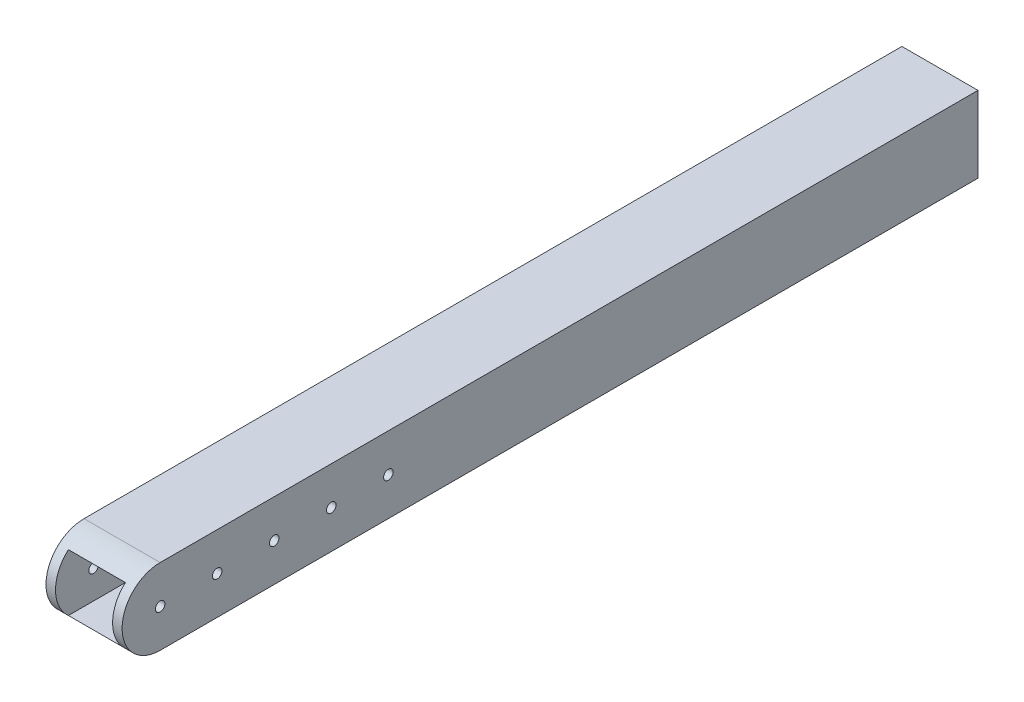
ISO-10303-21;
HEADER;
FILE_DESCRIPTION(('STEP AP214'),'2;1');
FILE_NAME('part.step','',(''),(''),'','','');
FILE_SCHEMA(('AUTOMOTIVE_DESIGN { 1 0 10303 214 1 1 1 1 }'));
ENDSEC;
DATA;
#1=APPLICATION_CONTEXT('core data for automotive mechanical design processes');
#2=APPLICATION_PROTOCOL_DEFINITION('international standard','automotive_design',2000,#1);
#3=PRODUCT_CONTEXT('',#1,'mechanical');
#4=PRODUCT('Part','Part','',(#3));
#5=PRODUCT_RELATED_PRODUCT_CATEGORY('part','',(#4));
#6=PRODUCT_DEFINITION_FORMATION('','',#4);
#7=PRODUCT_DEFINITION_CONTEXT('part definition',#1,'design');
#8=PRODUCT_DEFINITION('design','',#6,#7);
#9=PRODUCT_DEFINITION_SHAPE('','',#8);
#10=(LENGTH_UNIT() NAMED_UNIT(*) SI_UNIT(.MILLI.,.METRE.));
#11=(NAMED_UNIT(*) PLANE_ANGLE_UNIT() SI_UNIT($,.RADIAN.));
#12=(NAMED_UNIT(*) SI_UNIT($,.STERADIAN.) SOLID_ANGLE_UNIT());
#13=UNCERTAINTY_MEASURE_WITH_UNIT(LENGTH_MEASURE(1.E-05),#10,'distance_accuracy_value','');
#14=(GEOMETRIC_REPRESENTATION_CONTEXT(3) GLOBAL_UNCERTAINTY_ASSIGNED_CONTEXT((#13)) GLOBAL_UNIT_ASSIGNED_CONTEXT((#10,
#11,#12)) REPRESENTATION_CONTEXT('',''));
#15=CARTESIAN_POINT('',(0.,0.,0.));
#16=DIRECTION('',(0.,0.,1.));
#17=DIRECTION('',(1.,0.,0.));
#18=AXIS2_PLACEMENT_3D('',#15,#16,#17);
#19=CARTESIAN_POINT('',(20.,-20.,450.));
#20=DIRECTION('',(-1.,0.,0.));
#21=DIRECTION('',(0.,0.,1.));
#22=AXIS2_PLACEMENT_3D('',#19,#20,#21);
#23=PLANE('',#22);
#24=CARTESIAN_POINT('',(20.,0.,310.));
#25=DIRECTION('',(1.,0.,0.));
#26=DIRECTION('',(0.,0.,-1.));
#27=AXIS2_PLACEMENT_3D('',#24,#25,#26);
#28=CIRCLE('',#27,2.50000000000002);
#29=CARTESIAN_POINT('',(20.,0.,307.5));
#30=VERTEX_POINT('',#29);
#31=EDGE_CURVE('E269',#30,#30,#28,.T.);
#32=ORIENTED_EDGE('',*,*,#31,.F.);
#33=EDGE_LOOP('',(#32));
#34=FACE_BOUND('',#33,.T.);
#35=CARTESIAN_POINT('',(20.,0.,340.));
#36=DIRECTION('',(1.,0.,0.));
#37=DIRECTION('',(0.,0.,-1.));
#38=AXIS2_PLACEMENT_3D('',#35,#36,#37);
#39=CIRCLE('',#38,2.50000000000002);
#40=CARTESIAN_POINT('',(20.,0.,337.5));
#41=VERTEX_POINT('',#40);
#42=EDGE_CURVE('E263',#41,#41,#39,.T.);
#43=ORIENTED_EDGE('',*,*,#42,.F.);
#44=EDGE_LOOP('',(#43));
#45=FACE_BOUND('',#44,.T.);
#46=CARTESIAN_POINT('',(20.,0.,370.));
#47=DIRECTION('',(1.,0.,0.));
#48=DIRECTION('',(0.,0.,-1.));
#49=AXIS2_PLACEMENT_3D('',#46,#47,#48);
#50=CIRCLE('',#49,2.50000000000002);
#51=CARTESIAN_POINT('',(20.,0.,367.5));
#52=VERTEX_POINT('',#51);
#53=EDGE_CURVE('E257',#52,#52,#50,.T.);
#54=ORIENTED_EDGE('',*,*,#53,.F.);
#55=EDGE_LOOP('',(#54));
#56=FACE_BOUND('',#55,.T.);
#57=CARTESIAN_POINT('',(20.,0.,400.));
#58=DIRECTION('',(1.,0.,0.));
#59=DIRECTION('',(0.,0.,-1.));
#60=AXIS2_PLACEMENT_3D('',#57,#58,#59);
#61=CIRCLE('',#60,2.50000000000002);
#62=CARTESIAN_POINT('',(20.,0.,397.5));
#63=VERTEX_POINT('',#62);
#64=EDGE_CURVE('E251',#63,#63,#61,.T.);
#65=ORIENTED_EDGE('',*,*,#64,.F.);
#66=EDGE_LOOP('',(#65));
#67=FACE_BOUND('',#66,.T.);
#68=CARTESIAN_POINT('',(20.,0.,430.));
#69=DIRECTION('',(1.,0.,0.));
#70=DIRECTION('',(0.,0.,-1.));
#71=AXIS2_PLACEMENT_3D('',#68,#69,#70);
#72=CIRCLE('',#71,2.50000000000002);
#73=CARTESIAN_POINT('',(20.,0.,427.5));
#74=VERTEX_POINT('',#73);
#75=EDGE_CURVE('E156',#74,#74,#72,.T.);
#76=ORIENTED_EDGE('',*,*,#75,.F.);
#77=EDGE_LOOP('',(#76));
#78=FACE_BOUND('',#77,.T.);
#79=DIRECTION('',(0.,0.,-1.));
#80=VECTOR('',#79,1.);
#81=CARTESIAN_POINT('',(20.,20.,450.));
#82=LINE('',#81,#80);
#83=CARTESIAN_POINT('',(20.,20.,430.));
#84=VERTEX_POINT('',#83);
#85=CARTESIAN_POINT('',(20.,20.,0.));
#86=VERTEX_POINT('',#85);
#87=EDGE_CURVE('E141',#84,#86,#82,.T.);
#88=ORIENTED_EDGE('',*,*,#87,.F.);
#89=CARTESIAN_POINT('',(20.,0.,430.));
#90=DIRECTION('',(1.,0.,0.));
#91=DIRECTION('',(0.,0.,-1.));
#92=AXIS2_PLACEMENT_3D('',#89,#90,#91);
#93=CIRCLE('',#92,20.);
#94=CARTESIAN_POINT('',(20.,-20.,430.));
#95=VERTEX_POINT('',#94);
#96=EDGE_CURVE('E128',#84,#95,#93,.T.);
#97=ORIENTED_EDGE('',*,*,#96,.T.);
#98=DIRECTION('',(0.,0.,-1.));
#99=VECTOR('',#98,1.);
#100=CARTESIAN_POINT('',(20.,-20.,450.));
#101=LINE('',#100,#99);
#102=CARTESIAN_POINT('',(20.,-20.,0.));
#103=VERTEX_POINT('',#102);
#104=EDGE_CURVE('E83',#95,#103,#101,.T.);
#105=ORIENTED_EDGE('',*,*,#104,.T.);
#106=DIRECTION('',(0.,1.,0.));
#107=VECTOR('',#106,1.);
#108=CARTESIAN_POINT('',(20.,-20.,0.));
#109=LINE('',#108,#107);
#110=EDGE_CURVE('E147',#103,#86,#109,.T.);
#111=ORIENTED_EDGE('',*,*,#110,.T.);
#112=EDGE_LOOP('',(#88,#97,#105,#111));
#113=FACE_BOUND('',#112,.T.);
#114=ADVANCED_FACE('F62',(#34,#45,#56,#67,#78,#113),#23,.F.);
#115=CARTESIAN_POINT('',(-20.,-20.,450.));
#116=DIRECTION('',(1.,0.,0.));
#117=DIRECTION('',(0.,0.,-1.));
#118=AXIS2_PLACEMENT_3D('',#115,#116,#117);
#119=PLANE('',#118);
#120=CARTESIAN_POINT('',(-20.,0.,310.));
#121=DIRECTION('',(1.,0.,0.));
#122=DIRECTION('',(0.,0.,-1.));
#123=AXIS2_PLACEMENT_3D('',#120,#121,#122);
#124=CIRCLE('',#123,2.50000000000002);
#125=CARTESIAN_POINT('',(-20.,0.,307.5));
#126=VERTEX_POINT('',#125);
#127=EDGE_CURVE('E245',#126,#126,#124,.T.);
#128=ORIENTED_EDGE('',*,*,#127,.T.);
#129=EDGE_LOOP('',(#128));
#130=FACE_BOUND('',#129,.T.);
#131=CARTESIAN_POINT('',(-20.,0.,340.));
#132=DIRECTION('',(1.,0.,0.));
#133=DIRECTION('',(0.,0.,-1.));
#134=AXIS2_PLACEMENT_3D('',#131,#132,#133);
#135=CIRCLE('',#134,2.50000000000002);
#136=CARTESIAN_POINT('',(-20.,0.,337.5));
#137=VERTEX_POINT('',#136);
#138=EDGE_CURVE('E239',#137,#137,#135,.T.);
#139=ORIENTED_EDGE('',*,*,#138,.T.);
#140=EDGE_LOOP('',(#139));
#141=FACE_BOUND('',#140,.T.);
#142=CARTESIAN_POINT('',(-20.,0.,370.));
#143=DIRECTION('',(1.,0.,0.));
#144=DIRECTION('',(0.,0.,-1.));
#145=AXIS2_PLACEMENT_3D('',#142,#143,#144);
#146=CIRCLE('',#145,2.50000000000002);
#147=CARTESIAN_POINT('',(-20.,0.,367.5));
#148=VERTEX_POINT('',#147);
#149=EDGE_CURVE('E233',#148,#148,#146,.T.);
#150=ORIENTED_EDGE('',*,*,#149,.T.);
#151=EDGE_LOOP('',(#150));
#152=FACE_BOUND('',#151,.T.);
#153=CARTESIAN_POINT('',(-20.,0.,400.));
#154=DIRECTION('',(1.,0.,0.));
#155=DIRECTION('',(0.,0.,-1.));
#156=AXIS2_PLACEMENT_3D('',#153,#154,#155);
#157=CIRCLE('',#156,2.50000000000002);
#158=CARTESIAN_POINT('',(-20.,0.,397.5));
#159=VERTEX_POINT('',#158);
#160=EDGE_CURVE('E144',#159,#159,#157,.T.);
#161=ORIENTED_EDGE('',*,*,#160,.T.);
#162=EDGE_LOOP('',(#161));
#163=FACE_BOUND('',#162,.T.);
#164=CARTESIAN_POINT('',(-20.,0.,430.));
#165=DIRECTION('',(1.,0.,0.));
#166=DIRECTION('',(0.,0.,-1.));
#167=AXIS2_PLACEMENT_3D('',#164,#165,#166);
#168=CIRCLE('',#167,2.50000000000002);
#169=CARTESIAN_POINT('',(-20.,0.,427.5));
#170=VERTEX_POINT('',#169);
#171=EDGE_CURVE('E160',#170,#170,#168,.T.);
#172=ORIENTED_EDGE('',*,*,#171,.T.);
#173=EDGE_LOOP('',(#172));
#174=FACE_BOUND('',#173,.T.);
#175=CARTESIAN_POINT('',(-20.,0.,430.));
#176=DIRECTION('',(1.,0.,0.));
#177=DIRECTION('',(0.,0.,-1.));
#178=AXIS2_PLACEMENT_3D('',#175,#176,#177);
#179=CIRCLE('',#178,20.);
#180=CARTESIAN_POINT('',(-20.,20.,430.));
#181=VERTEX_POINT('',#180);
#182=CARTESIAN_POINT('',(-20.,-20.,430.));
#183=VERTEX_POINT('',#182);
#184=EDGE_CURVE('E163',#181,#183,#179,.T.);
#185=ORIENTED_EDGE('',*,*,#184,.F.);
#186=DIRECTION('',(0.,0.,-1.));
#187=VECTOR('',#186,1.);
#188=CARTESIAN_POINT('',(-20.,20.,450.));
#189=LINE('',#188,#187);
#190=CARTESIAN_POINT('',(-20.,20.,0.));
#191=VERTEX_POINT('',#190);
#192=EDGE_CURVE('E143',#181,#191,#189,.T.);
#193=ORIENTED_EDGE('',*,*,#192,.T.);
#194=DIRECTION('',(0.,-1.,0.));
#195=VECTOR('',#194,1.);
#196=CARTESIAN_POINT('',(-20.,-20.,0.));
#197=LINE('',#196,#195);
#198=CARTESIAN_POINT('',(-20.,-20.,0.));
#199=VERTEX_POINT('',#198);
#200=EDGE_CURVE('E195',#191,#199,#197,.T.);
#201=ORIENTED_EDGE('',*,*,#200,.T.);
#202=DIRECTION('',(0.,0.,-1.));
#203=VECTOR('',#202,1.);
#204=CARTESIAN_POINT('',(-20.,-20.,450.));
#205=LINE('',#204,#203);
#206=EDGE_CURVE('E149',#183,#199,#205,.T.);
#207=ORIENTED_EDGE('',*,*,#206,.F.);
#208=EDGE_LOOP('',(#185,#193,#201,#207));
#209=FACE_BOUND('',#208,.T.);
#210=ADVANCED_FACE('F206',(#130,#141,#152,#163,#174,#209),#119,.F.);
#211=CARTESIAN_POINT('',(-15.,-15.,450.));
#212=DIRECTION('',(1.,0.,0.));
#213=DIRECTION('',(0.,0.,-1.));
#214=AXIS2_PLACEMENT_3D('',#211,#212,#213);
#215=PLANE('',#214);
#216=CARTESIAN_POINT('',(-15.,0.,310.));
#217=DIRECTION('',(1.,0.,0.));
#218=DIRECTION('',(0.,0.,-1.));
#219=AXIS2_PLACEMENT_3D('',#216,#217,#218);
#220=CIRCLE('',#219,2.50000000000002);
#221=CARTESIAN_POINT('',(-15.,0.,307.5));
#222=VERTEX_POINT('',#221);
#223=EDGE_CURVE('E248',#222,#222,#220,.T.);
#224=ORIENTED_EDGE('',*,*,#223,.F.);
#225=EDGE_LOOP('',(#224));
#226=FACE_BOUND('',#225,.T.);
#227=CARTESIAN_POINT('',(-15.,0.,340.));
#228=DIRECTION('',(1.,0.,0.));
#229=DIRECTION('',(0.,0.,-1.));
#230=AXIS2_PLACEMENT_3D('',#227,#228,#229);
#231=CIRCLE('',#230,2.50000000000002);
#232=CARTESIAN_POINT('',(-15.,0.,337.5));
#233=VERTEX_POINT('',#232);
#234=EDGE_CURVE('E242',#233,#233,#231,.T.);
#235=ORIENTED_EDGE('',*,*,#234,.F.);
#236=EDGE_LOOP('',(#235));
#237=FACE_BOUND('',#236,.T.);
#238=CARTESIAN_POINT('',(-15.,0.,370.));
#239=DIRECTION('',(1.,0.,0.));
#240=DIRECTION('',(0.,0.,-1.));
#241=AXIS2_PLACEMENT_3D('',#238,#239,#240);
#242=CIRCLE('',#241,2.50000000000002);
#243=CARTESIAN_POINT('',(-15.,0.,367.5));
#244=VERTEX_POINT('',#243);
#245=EDGE_CURVE('E236',#244,#244,#242,.T.);
#246=ORIENTED_EDGE('',*,*,#245,.F.);
#247=EDGE_LOOP('',(#246));
#248=FACE_BOUND('',#247,.T.);
#249=CARTESIAN_POINT('',(-15.,0.,400.));
#250=DIRECTION('',(1.,0.,0.));
#251=DIRECTION('',(0.,0.,-1.));
#252=AXIS2_PLACEMENT_3D('',#249,#250,#251);
#253=CIRCLE('',#252,2.50000000000002);
#254=CARTESIAN_POINT('',(-15.,0.,397.5));
#255=VERTEX_POINT('',#254);
#256=EDGE_CURVE('E230',#255,#255,#253,.T.);
#257=ORIENTED_EDGE('',*,*,#256,.F.);
#258=EDGE_LOOP('',(#257));
#259=FACE_BOUND('',#258,.T.);
#260=CARTESIAN_POINT('',(-15.,0.,430.));
#261=DIRECTION('',(1.,0.,0.));
#262=DIRECTION('',(0.,0.,-1.));
#263=AXIS2_PLACEMENT_3D('',#260,#261,#262);
#264=CIRCLE('',#263,2.50000000000002);
#265=CARTESIAN_POINT('',(-15.,0.,427.5));
#266=VERTEX_POINT('',#265);
#267=EDGE_CURVE('E155',#266,#266,#264,.T.);
#268=ORIENTED_EDGE('',*,*,#267,.F.);
#269=EDGE_LOOP('',(#268));
#270=FACE_BOUND('',#269,.T.);
#271=DIRECTION('',(0.,0.,-1.));
#272=VECTOR('',#271,1.);
#273=CARTESIAN_POINT('',(-15.,15.,450.));
#274=LINE('',#273,#272);
#275=CARTESIAN_POINT('',(-15.,15.,443.228756555323));
#276=VERTEX_POINT('',#275);
#277=CARTESIAN_POINT('',(-15.,15.,0.));
#278=VERTEX_POINT('',#277);
#279=EDGE_CURVE('E75',#276,#278,#274,.T.);
#280=ORIENTED_EDGE('',*,*,#279,.F.);
#281=CARTESIAN_POINT('',(-15.,0.,430.));
#282=DIRECTION('',(1.,0.,0.));
#283=DIRECTION('',(0.,0.,-1.));
#284=AXIS2_PLACEMENT_3D('',#281,#282,#283);
#285=CIRCLE('',#284,20.);
#286=CARTESIAN_POINT('',(-15.,-15.,443.228756555323));
#287=VERTEX_POINT('',#286);
#288=EDGE_CURVE('E167',#276,#287,#285,.T.);
#289=ORIENTED_EDGE('',*,*,#288,.T.);
#290=DIRECTION('',(0.,0.,-1.));
#291=VECTOR('',#290,1.);
#292=CARTESIAN_POINT('',(-15.,-15.,450.));
#293=LINE('',#292,#291);
#294=CARTESIAN_POINT('',(-15.,-15.,0.));
#295=VERTEX_POINT('',#294);
#296=EDGE_CURVE('E190',#287,#295,#293,.T.);
#297=ORIENTED_EDGE('',*,*,#296,.T.);
#298=DIRECTION('',(0.,-1.,0.));
#299=VECTOR('',#298,1.);
#300=CARTESIAN_POINT('',(-15.,-15.,0.));
#301=LINE('',#300,#299);
#302=EDGE_CURVE('E173',#278,#295,#301,.T.);
#303=ORIENTED_EDGE('',*,*,#302,.F.);
#304=EDGE_LOOP('',(#280,#289,#297,#303));
#305=FACE_BOUND('',#304,.T.);
#306=ADVANCED_FACE('F281',(#226,#237,#248,#259,#270,#305),#215,.T.);
#307=CARTESIAN_POINT('',(15.,-15.,450.));
#308=DIRECTION('',(-1.,0.,0.));
#309=DIRECTION('',(0.,-1.,0.));
#310=AXIS2_PLACEMENT_3D('',#307,#308,#309);
#311=PLANE('',#310);
#312=CARTESIAN_POINT('',(15.,0.,310.));
#313=DIRECTION('',(-1.,0.,0.));
#314=DIRECTION('',(0.,-1.,0.));
#315=AXIS2_PLACEMENT_3D('',#312,#313,#314);
#316=CIRCLE('',#315,2.50000000000002);
#317=CARTESIAN_POINT('',(15.,-2.50000000000002,310.));
#318=VERTEX_POINT('',#317);
#319=EDGE_CURVE('E272',#318,#318,#316,.T.);
#320=ORIENTED_EDGE('',*,*,#319,.F.);
#321=EDGE_LOOP('',(#320));
#322=FACE_BOUND('',#321,.T.);
#323=CARTESIAN_POINT('',(15.,0.,340.));
#324=DIRECTION('',(-1.,0.,0.));
#325=DIRECTION('',(0.,-1.,0.));
#326=AXIS2_PLACEMENT_3D('',#323,#324,#325);
#327=CIRCLE('',#326,2.50000000000002);
#328=CARTESIAN_POINT('',(15.,-2.50000000000002,340.));
#329=VERTEX_POINT('',#328);
#330=EDGE_CURVE('E266',#329,#329,#327,.T.);
#331=ORIENTED_EDGE('',*,*,#330,.F.);
#332=EDGE_LOOP('',(#331));
#333=FACE_BOUND('',#332,.T.);
#334=CARTESIAN_POINT('',(15.,0.,370.));
#335=DIRECTION('',(-1.,0.,0.));
#336=DIRECTION('',(0.,-1.,0.));
#337=AXIS2_PLACEMENT_3D('',#334,#335,#336);
#338=CIRCLE('',#337,2.50000000000002);
#339=CARTESIAN_POINT('',(15.,-2.50000000000002,370.));
#340=VERTEX_POINT('',#339);
#341=EDGE_CURVE('E260',#340,#340,#338,.T.);
#342=ORIENTED_EDGE('',*,*,#341,.F.);
#343=EDGE_LOOP('',(#342));
#344=FACE_BOUND('',#343,.T.);
#345=CARTESIAN_POINT('',(15.,0.,400.));
#346=DIRECTION('',(-1.,0.,0.));
#347=DIRECTION('',(0.,-1.,0.));
#348=AXIS2_PLACEMENT_3D('',#345,#346,#347);
#349=CIRCLE('',#348,2.50000000000002);
#350=CARTESIAN_POINT('',(15.,-2.50000000000002,400.));
#351=VERTEX_POINT('',#350);
#352=EDGE_CURVE('E254',#351,#351,#349,.T.);
#353=ORIENTED_EDGE('',*,*,#352,.F.);
#354=EDGE_LOOP('',(#353));
#355=FACE_BOUND('',#354,.T.);
#356=CARTESIAN_POINT('',(15.,0.,430.));
#357=DIRECTION('',(-1.,0.,0.));
#358=DIRECTION('',(0.,-1.,0.));
#359=AXIS2_PLACEMENT_3D('',#356,#357,#358);
#360=CIRCLE('',#359,2.50000000000002);
#361=CARTESIAN_POINT('',(15.,-2.50000000000002,430.));
#362=VERTEX_POINT('',#361);
#363=EDGE_CURVE('E153',#362,#362,#360,.T.);
#364=ORIENTED_EDGE('',*,*,#363,.F.);
#365=EDGE_LOOP('',(#364));
#366=FACE_BOUND('',#365,.T.);
#367=CARTESIAN_POINT('',(15.,0.,430.));
#368=DIRECTION('',(-1.,0.,0.));
#369=DIRECTION('',(0.,-1.,0.));
#370=AXIS2_PLACEMENT_3D('',#367,#368,#369);
#371=CIRCLE('',#370,20.);
#372=CARTESIAN_POINT('',(15.,-15.,443.228756555323));
#373=VERTEX_POINT('',#372);
#374=CARTESIAN_POINT('',(15.,15.,443.228756555323));
#375=VERTEX_POINT('',#374);
#376=EDGE_CURVE('E69',#373,#375,#371,.T.);
#377=ORIENTED_EDGE('',*,*,#376,.T.);
#378=DIRECTION('',(0.,0.,-1.));
#379=VECTOR('',#378,1.);
#380=CARTESIAN_POINT('',(15.,15.,450.));
#381=LINE('',#380,#379);
#382=CARTESIAN_POINT('',(15.,15.,0.));
#383=VERTEX_POINT('',#382);
#384=EDGE_CURVE('E186',#375,#383,#381,.T.);
#385=ORIENTED_EDGE('',*,*,#384,.T.);
#386=DIRECTION('',(0.,1.,0.));
#387=VECTOR('',#386,1.);
#388=CARTESIAN_POINT('',(15.,-15.,0.));
#389=LINE('',#388,#387);
#390=CARTESIAN_POINT('',(15.,-15.,0.));
#391=VERTEX_POINT('',#390);
#392=EDGE_CURVE('E179',#391,#383,#389,.T.);
#393=ORIENTED_EDGE('',*,*,#392,.F.);
#394=DIRECTION('',(0.,0.,-1.));
#395=VECTOR('',#394,1.);
#396=CARTESIAN_POINT('',(15.,-15.,450.));
#397=LINE('',#396,#395);
#398=EDGE_CURVE('E188',#373,#391,#397,.T.);
#399=ORIENTED_EDGE('',*,*,#398,.F.);
#400=EDGE_LOOP('',(#377,#385,#393,#399));
#401=FACE_BOUND('',#400,.T.);
#402=ADVANCED_FACE('F218',(#322,#333,#344,#355,#366,#401),#311,.T.);
#403=CARTESIAN_POINT('',(-15.,15.,450.));
#404=DIRECTION('',(0.,-1.,0.));
#405=DIRECTION('',(1.,0.,0.));
#406=AXIS2_PLACEMENT_3D('',#403,#404,#405);
#407=PLANE('',#406);
#408=ORIENTED_EDGE('',*,*,#384,.F.);
#409=DIRECTION('',(1.,0.,0.));
#410=VECTOR('',#409,1.);
#411=CARTESIAN_POINT('',(-55.9999999999999,15.,443.228756555323));
#412=LINE('',#411,#410);
#413=EDGE_CURVE('E12',#375,#276,#412,.F.);
#414=ORIENTED_EDGE('',*,*,#413,.T.);
#415=ORIENTED_EDGE('',*,*,#279,.T.);
#416=DIRECTION('',(-1.,0.,0.));
#417=VECTOR('',#416,1.);
#418=CARTESIAN_POINT('',(-15.,15.,0.));
#419=LINE('',#418,#417);
#420=EDGE_CURVE('E182',#383,#278,#419,.T.);
#421=ORIENTED_EDGE('',*,*,#420,.F.);
#422=EDGE_LOOP('',(#408,#414,#415,#421));
#423=FACE_BOUND('',#422,.T.);
#424=ADVANCED_FACE('F215',(#423),#407,.T.);
#425=CARTESIAN_POINT('',(-20.,-20.,450.));
#426=DIRECTION('',(0.,1.,0.));
#427=DIRECTION('',(0.,0.,1.));
#428=AXIS2_PLACEMENT_3D('',#425,#426,#427);
#429=PLANE('',#428);
#430=DIRECTION('',(1.,0.,0.));
#431=VECTOR('',#430,1.);
#432=CARTESIAN_POINT('',(-55.9999999999999,-20.,430.));
#433=LINE('',#432,#431);
#434=EDGE_CURVE('E135',#183,#95,#433,.T.);
#435=ORIENTED_EDGE('',*,*,#434,.F.);
#436=ORIENTED_EDGE('',*,*,#206,.T.);
#437=DIRECTION('',(1.,0.,0.));
#438=VECTOR('',#437,1.);
#439=CARTESIAN_POINT('',(-20.,-20.,0.));
#440=LINE('',#439,#438);
#441=EDGE_CURVE('E198',#199,#103,#440,.T.);
#442=ORIENTED_EDGE('',*,*,#441,.T.);
#443=ORIENTED_EDGE('',*,*,#104,.F.);
#444=EDGE_LOOP('',(#435,#436,#442,#443));
#445=FACE_BOUND('',#444,.T.);
#446=ADVANCED_FACE('F202',(#445),#429,.F.);
#447=CARTESIAN_POINT('',(-15.,-15.,450.));
#448=DIRECTION('',(0.,1.,0.));
#449=DIRECTION('',(0.,0.,1.));
#450=AXIS2_PLACEMENT_3D('',#447,#448,#449);
#451=PLANE('',#450);
#452=ORIENTED_EDGE('',*,*,#296,.F.);
#453=DIRECTION('',(1.,0.,0.));
#454=VECTOR('',#453,1.);
#455=CARTESIAN_POINT('',(-55.9999999999999,-15.,443.228756555323));
#456=LINE('',#455,#454);
#457=EDGE_CURVE('E222',#287,#373,#456,.T.);
#458=ORIENTED_EDGE('',*,*,#457,.T.);
#459=ORIENTED_EDGE('',*,*,#398,.T.);
#460=DIRECTION('',(1.,0.,0.));
#461=VECTOR('',#460,1.);
#462=CARTESIAN_POINT('',(-15.,-15.,0.));
#463=LINE('',#462,#461);
#464=EDGE_CURVE('E176',#295,#391,#463,.T.);
#465=ORIENTED_EDGE('',*,*,#464,.F.);
#466=EDGE_LOOP('',(#452,#458,#459,#465));
#467=FACE_BOUND('',#466,.T.);
#468=ADVANCED_FACE('F211',(#467),#451,.T.);
#469=CARTESIAN_POINT('',(0.,0.,0.));
#470=DIRECTION('',(0.,0.,-1.));
#471=DIRECTION('',(-1.,0.,0.));
#472=AXIS2_PLACEMENT_3D('',#469,#470,#471);
#473=PLANE('',#472);
#474=ORIENTED_EDGE('',*,*,#110,.F.);
#475=ORIENTED_EDGE('',*,*,#441,.F.);
#476=ORIENTED_EDGE('',*,*,#200,.F.);
#477=DIRECTION('',(-1.,0.,0.));
#478=VECTOR('',#477,1.);
#479=CARTESIAN_POINT('',(-20.,20.,0.));
#480=LINE('',#479,#478);
#481=EDGE_CURVE('E193',#86,#191,#480,.T.);
#482=ORIENTED_EDGE('',*,*,#481,.F.);
#483=EDGE_LOOP('',(#474,#475,#476,#482));
#484=FACE_BOUND('',#483,.T.);
#485=ORIENTED_EDGE('',*,*,#420,.T.);
#486=ORIENTED_EDGE('',*,*,#302,.T.);
#487=ORIENTED_EDGE('',*,*,#464,.T.);
#488=ORIENTED_EDGE('',*,*,#392,.T.);
#489=EDGE_LOOP('',(#485,#486,#487,#488));
#490=FACE_BOUND('',#489,.T.);
#491=ADVANCED_FACE('F208',(#484,#490),#473,.T.);
#492=CARTESIAN_POINT('',(-20.,20.,450.));
#493=DIRECTION('',(0.,-1.,0.));
#494=DIRECTION('',(0.,0.,-1.));
#495=AXIS2_PLACEMENT_3D('',#492,#493,#494);
#496=PLANE('',#495);
#497=ORIENTED_EDGE('',*,*,#192,.F.);
#498=DIRECTION('',(1.,0.,0.));
#499=VECTOR('',#498,1.);
#500=CARTESIAN_POINT('',(-55.9999999999999,20.,430.));
#501=LINE('',#500,#499);
#502=EDGE_CURVE('E132',#181,#84,#501,.T.);
#503=ORIENTED_EDGE('',*,*,#502,.T.);
#504=ORIENTED_EDGE('',*,*,#87,.T.);
#505=ORIENTED_EDGE('',*,*,#481,.T.);
#506=EDGE_LOOP('',(#497,#503,#504,#505));
#507=FACE_BOUND('',#506,.T.);
#508=ADVANCED_FACE('F139',(#507),#496,.F.);
#509=CARTESIAN_POINT('',(-430.,0.,430.));
#510=DIRECTION('',(1.,0.,0.));
#511=DIRECTION('',(0.,0.,-1.));
#512=AXIS2_PLACEMENT_3D('',#509,#510,#511);
#513=CYLINDRICAL_SURFACE('',#512,2.50000000000002);
#514=ORIENTED_EDGE('',*,*,#363,.T.);
#515=EDGE_LOOP('',(#514));
#516=FACE_BOUND('',#515,.T.);
#517=ORIENTED_EDGE('',*,*,#75,.T.);
#518=EDGE_LOOP('',(#517));
#519=FACE_BOUND('',#518,.T.);
#520=ADVANCED_FACE('F341',(#516,#519),#513,.F.);
#521=ORIENTED_EDGE('',*,*,#267,.T.);
#522=EDGE_LOOP('',(#521));
#523=FACE_BOUND('',#522,.T.);
#524=ORIENTED_EDGE('',*,*,#171,.F.);
#525=EDGE_LOOP('',(#524));
#526=FACE_BOUND('',#525,.T.);
#527=ADVANCED_FACE('F340',(#523,#526),#513,.F.);
#528=CARTESIAN_POINT('',(-55.9999999999999,0.,430.));
#529=DIRECTION('',(1.,0.,0.));
#530=DIRECTION('',(0.,0.,-1.));
#531=AXIS2_PLACEMENT_3D('',#528,#529,#530);
#532=CYLINDRICAL_SURFACE('',#531,20.);
#533=ORIENTED_EDGE('',*,*,#96,.F.);
#534=ORIENTED_EDGE('',*,*,#502,.F.);
#535=ORIENTED_EDGE('',*,*,#184,.T.);
#536=ORIENTED_EDGE('',*,*,#434,.T.);
#537=EDGE_LOOP('',(#533,#534,#535,#536));
#538=FACE_BOUND('',#537,.T.);
#539=ORIENTED_EDGE('',*,*,#413,.F.);
#540=ORIENTED_EDGE('',*,*,#376,.F.);
#541=ORIENTED_EDGE('',*,*,#457,.F.);
#542=ORIENTED_EDGE('',*,*,#288,.F.);
#543=EDGE_LOOP('',(#539,#540,#541,#542));
#544=FACE_BOUND('',#543,.T.);
#545=ADVANCED_FACE('F130',(#538,#544),#532,.T.);
#546=CARTESIAN_POINT('',(-430.,0.,400.));
#547=DIRECTION('',(1.,0.,0.));
#548=DIRECTION('',(0.,0.,-1.));
#549=AXIS2_PLACEMENT_3D('',#546,#547,#548);
#550=CYLINDRICAL_SURFACE('',#549,2.50000000000002);
#551=ORIENTED_EDGE('',*,*,#256,.T.);
#552=EDGE_LOOP('',(#551));
#553=FACE_BOUND('',#552,.T.);
#554=ORIENTED_EDGE('',*,*,#160,.F.);
#555=EDGE_LOOP('',(#554));
#556=FACE_BOUND('',#555,.T.);
#557=ADVANCED_FACE('F333',(#553,#556),#550,.F.);
#558=CARTESIAN_POINT('',(-430.,0.,370.));
#559=DIRECTION('',(1.,0.,0.));
#560=DIRECTION('',(0.,0.,-1.));
#561=AXIS2_PLACEMENT_3D('',#558,#559,#560);
#562=CYLINDRICAL_SURFACE('',#561,2.50000000000002);
#563=ORIENTED_EDGE('',*,*,#245,.T.);
#564=EDGE_LOOP('',(#563));
#565=FACE_BOUND('',#564,.T.);
#566=ORIENTED_EDGE('',*,*,#149,.F.);
#567=EDGE_LOOP('',(#566));
#568=FACE_BOUND('',#567,.T.);
#569=ADVANCED_FACE('F329',(#565,#568),#562,.F.);
#570=CARTESIAN_POINT('',(-430.,0.,340.));
#571=DIRECTION('',(1.,0.,0.));
#572=DIRECTION('',(0.,0.,-1.));
#573=AXIS2_PLACEMENT_3D('',#570,#571,#572);
#574=CYLINDRICAL_SURFACE('',#573,2.50000000000002);
#575=ORIENTED_EDGE('',*,*,#234,.T.);
#576=EDGE_LOOP('',(#575));
#577=FACE_BOUND('',#576,.T.);
#578=ORIENTED_EDGE('',*,*,#138,.F.);
#579=EDGE_LOOP('',(#578));
#580=FACE_BOUND('',#579,.T.);
#581=ADVANCED_FACE('F325',(#577,#580),#574,.F.);
#582=CARTESIAN_POINT('',(-430.,0.,310.));
#583=DIRECTION('',(1.,0.,0.));
#584=DIRECTION('',(0.,0.,-1.));
#585=AXIS2_PLACEMENT_3D('',#582,#583,#584);
#586=CYLINDRICAL_SURFACE('',#585,2.50000000000002);
#587=ORIENTED_EDGE('',*,*,#223,.T.);
#588=EDGE_LOOP('',(#587));
#589=FACE_BOUND('',#588,.T.);
#590=ORIENTED_EDGE('',*,*,#127,.F.);
#591=EDGE_LOOP('',(#590));
#592=FACE_BOUND('',#591,.T.);
#593=ADVANCED_FACE('F294',(#589,#592),#586,.F.);
#594=CARTESIAN_POINT('',(-430.,0.,400.));
#595=DIRECTION('',(1.,0.,0.));
#596=DIRECTION('',(0.,0.,-1.));
#597=AXIS2_PLACEMENT_3D('',#594,#595,#596);
#598=CYLINDRICAL_SURFACE('',#597,2.50000000000002);
#599=ORIENTED_EDGE('',*,*,#352,.T.);
#600=EDGE_LOOP('',(#599));
#601=FACE_BOUND('',#600,.T.);
#602=ORIENTED_EDGE('',*,*,#64,.T.);
#603=EDGE_LOOP('',(#602));
#604=FACE_BOUND('',#603,.T.);
#605=ADVANCED_FACE('F290',(#601,#604),#598,.F.);
#606=CARTESIAN_POINT('',(-430.,0.,370.));
#607=DIRECTION('',(1.,0.,0.));
#608=DIRECTION('',(0.,0.,-1.));
#609=AXIS2_PLACEMENT_3D('',#606,#607,#608);
#610=CYLINDRICAL_SURFACE('',#609,2.50000000000002);
#611=ORIENTED_EDGE('',*,*,#341,.T.);
#612=EDGE_LOOP('',(#611));
#613=FACE_BOUND('',#612,.T.);
#614=ORIENTED_EDGE('',*,*,#53,.T.);
#615=EDGE_LOOP('',(#614));
#616=FACE_BOUND('',#615,.T.);
#617=ADVANCED_FACE('F293',(#613,#616),#610,.F.);
#618=CARTESIAN_POINT('',(-430.,0.,340.));
#619=DIRECTION('',(1.,0.,0.));
#620=DIRECTION('',(0.,0.,-1.));
#621=AXIS2_PLACEMENT_3D('',#618,#619,#620);
#622=CYLINDRICAL_SURFACE('',#621,2.50000000000002);
#623=ORIENTED_EDGE('',*,*,#330,.T.);
#624=EDGE_LOOP('',(#623));
#625=FACE_BOUND('',#624,.T.);
#626=ORIENTED_EDGE('',*,*,#42,.T.);
#627=EDGE_LOOP('',(#626));
#628=FACE_BOUND('',#627,.T.);
#629=ADVANCED_FACE('F313',(#625,#628),#622,.F.);
#630=CARTESIAN_POINT('',(-430.,0.,310.));
#631=DIRECTION('',(1.,0.,0.));
#632=DIRECTION('',(0.,0.,-1.));
#633=AXIS2_PLACEMENT_3D('',#630,#631,#632);
#634=CYLINDRICAL_SURFACE('',#633,2.50000000000002);
#635=ORIENTED_EDGE('',*,*,#319,.T.);
#636=EDGE_LOOP('',(#635));
#637=FACE_BOUND('',#636,.T.);
#638=ORIENTED_EDGE('',*,*,#31,.T.);
#639=EDGE_LOOP('',(#638));
#640=FACE_BOUND('',#639,.T.);
#641=ADVANCED_FACE('F276',(#637,#640),#634,.F.);
#642=CLOSED_SHELL('',(#114,#210,#306,#402,#424,#446,#468,#491,#508,#520,#527,#545,#557,#569,
#581,#593,#605,#617,#629,#641));
#643=MANIFOLD_SOLID_BREP('B2',#642);
#644=ADVANCED_BREP_SHAPE_REPRESENTATION('',(#18,#643),#14);
#645=SHAPE_DEFINITION_REPRESENTATION(#9,#644);
ENDSEC;
END-ISO-10303-21;
